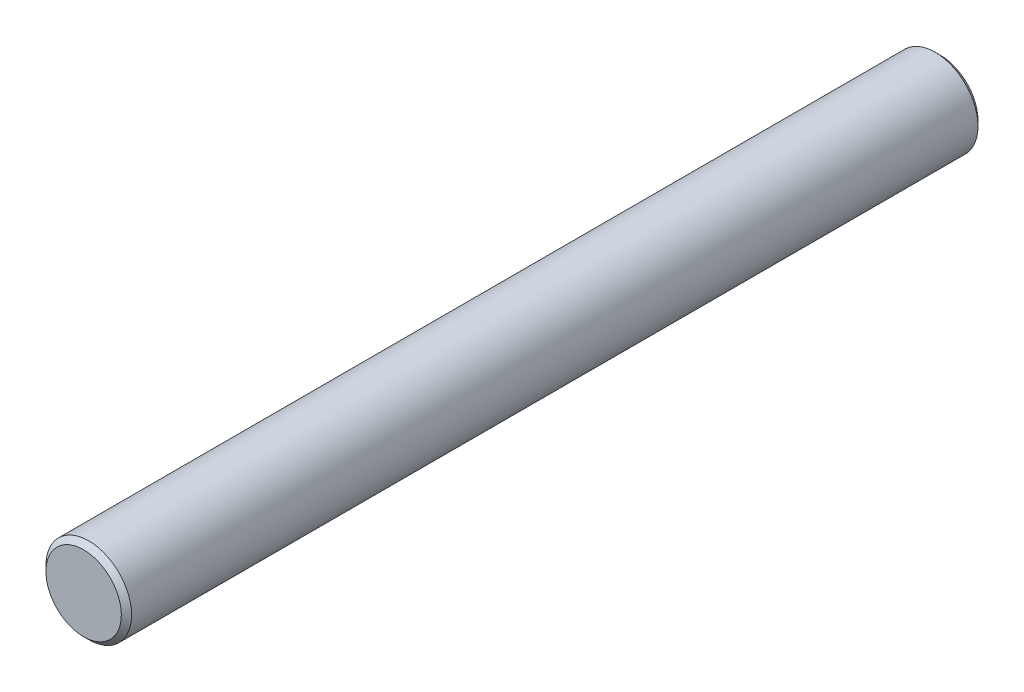
ISO-10303-21;
HEADER;
FILE_DESCRIPTION(('STEP AP214'),'2;1');
FILE_NAME('part.step','',(''),(''),'','','');
FILE_SCHEMA(('AUTOMOTIVE_DESIGN { 1 0 10303 214 1 1 1 1 }'));
ENDSEC;
DATA;
#1=APPLICATION_CONTEXT('core data for automotive mechanical design processes');
#2=APPLICATION_PROTOCOL_DEFINITION('international standard','automotive_design',2000,#1);
#3=PRODUCT_CONTEXT('',#1,'mechanical');
#4=PRODUCT('Part','Part','',(#3));
#5=PRODUCT_RELATED_PRODUCT_CATEGORY('part','',(#4));
#6=PRODUCT_DEFINITION_FORMATION('','',#4);
#7=PRODUCT_DEFINITION_CONTEXT('part definition',#1,'design');
#8=PRODUCT_DEFINITION('design','',#6,#7);
#9=PRODUCT_DEFINITION_SHAPE('','',#8);
#10=(LENGTH_UNIT() NAMED_UNIT(*) SI_UNIT(.MILLI.,.METRE.));
#11=(NAMED_UNIT(*) PLANE_ANGLE_UNIT() SI_UNIT($,.RADIAN.));
#12=(NAMED_UNIT(*) SI_UNIT($,.STERADIAN.) SOLID_ANGLE_UNIT());
#13=UNCERTAINTY_MEASURE_WITH_UNIT(LENGTH_MEASURE(1.E-05),#10,'distance_accuracy_value','');
#14=(GEOMETRIC_REPRESENTATION_CONTEXT(3) GLOBAL_UNCERTAINTY_ASSIGNED_CONTEXT((#13)) GLOBAL_UNIT_ASSIGNED_CONTEXT((#10,
#11,#12)) REPRESENTATION_CONTEXT('',''));
#15=CARTESIAN_POINT('',(0.,0.,0.));
#16=DIRECTION('',(0.,0.,1.));
#17=DIRECTION('',(1.,0.,0.));
#18=AXIS2_PLACEMENT_3D('',#15,#16,#17);
#19=CARTESIAN_POINT('',(0.,0.,50.));
#20=DIRECTION('',(0.,0.,-1.));
#21=DIRECTION('',(-1.,0.,0.));
#22=AXIS2_PLACEMENT_3D('',#19,#20,#21);
#23=CYLINDRICAL_SURFACE('',#22,2.5);
#24=CARTESIAN_POINT('',(0.,0.,0.299999999999995));
#25=DIRECTION('',(0.,0.,1.));
#26=DIRECTION('',(1.,0.,0.));
#27=AXIS2_PLACEMENT_3D('',#24,#25,#26);
#28=CIRCLE('',#27,2.5);
#29=CARTESIAN_POINT('',(2.5,0.,0.299999999999995));
#30=VERTEX_POINT('',#29);
#31=EDGE_CURVE('E44',#30,#30,#28,.T.);
#32=ORIENTED_EDGE('',*,*,#31,.T.);
#33=EDGE_LOOP('',(#32));
#34=FACE_BOUND('',#33,.T.);
#35=CARTESIAN_POINT('',(0.,0.,49.7));
#36=DIRECTION('',(0.,0.,1.));
#37=DIRECTION('',(1.,0.,0.));
#38=AXIS2_PLACEMENT_3D('',#35,#36,#37);
#39=CIRCLE('',#38,2.5);
#40=CARTESIAN_POINT('',(2.5,0.,49.7));
#41=VERTEX_POINT('',#40);
#42=EDGE_CURVE('E48',#41,#41,#39,.F.);
#43=ORIENTED_EDGE('',*,*,#42,.T.);
#44=EDGE_LOOP('',(#43));
#45=FACE_BOUND('',#44,.T.);
#46=ADVANCED_FACE('F33',(#34,#45),#23,.T.);
#47=CARTESIAN_POINT('',(0.,0.,50.));
#48=DIRECTION('',(0.,0.,1.));
#49=DIRECTION('',(1.,0.,0.));
#50=AXIS2_PLACEMENT_3D('',#47,#48,#49);
#51=PLANE('',#50);
#52=CARTESIAN_POINT('',(0.,0.,50.));
#53=DIRECTION('',(0.,0.,1.));
#54=DIRECTION('',(1.,0.,0.));
#55=AXIS2_PLACEMENT_3D('',#52,#53,#54);
#56=CIRCLE('',#55,2.2);
#57=CARTESIAN_POINT('',(2.2,0.,50.));
#58=VERTEX_POINT('',#57);
#59=EDGE_CURVE('E10',#58,#58,#56,.T.);
#60=ORIENTED_EDGE('',*,*,#59,.T.);
#61=EDGE_LOOP('',(#60));
#62=FACE_BOUND('',#61,.T.);
#63=ADVANCED_FACE('F64',(#62),#51,.T.);
#64=CARTESIAN_POINT('',(0.,0.,0.));
#65=DIRECTION('',(0.,0.,1.));
#66=DIRECTION('',(1.,0.,0.));
#67=AXIS2_PLACEMENT_3D('',#64,#65,#66);
#68=PLANE('',#67);
#69=CARTESIAN_POINT('',(0.,0.,0.));
#70=DIRECTION('',(0.,0.,1.));
#71=DIRECTION('',(1.,0.,0.));
#72=AXIS2_PLACEMENT_3D('',#69,#70,#71);
#73=CIRCLE('',#72,2.20000000000001);
#74=CARTESIAN_POINT('',(2.20000000000001,0.,0.));
#75=VERTEX_POINT('',#74);
#76=EDGE_CURVE('E40',#75,#75,#73,.F.);
#77=ORIENTED_EDGE('',*,*,#76,.T.);
#78=EDGE_LOOP('',(#77));
#79=FACE_BOUND('',#78,.T.);
#80=ADVANCED_FACE('F61',(#79),#68,.F.);
#81=CARTESIAN_POINT('',(0.,0.,0.299999999999995));
#82=DIRECTION('',(0.,0.,1.));
#83=DIRECTION('',(1.,0.,0.));
#84=AXIS2_PLACEMENT_3D('',#81,#82,#83);
#85=CONICAL_SURFACE('',#84,2.5,0.785398163397445);
#86=ORIENTED_EDGE('',*,*,#76,.F.);
#87=EDGE_LOOP('',(#86));
#88=FACE_BOUND('',#87,.T.);
#89=ORIENTED_EDGE('',*,*,#31,.F.);
#90=EDGE_LOOP('',(#89));
#91=FACE_BOUND('',#90,.T.);
#92=ADVANCED_FACE('F57',(#88,#91),#85,.T.);
#93=CARTESIAN_POINT('',(0.,0.,50.));
#94=DIRECTION('',(0.,0.,-1.));
#95=DIRECTION('',(-1.,0.,0.));
#96=AXIS2_PLACEMENT_3D('',#93,#94,#95);
#97=CONICAL_SURFACE('',#96,2.2,0.785398163397456);
#98=ORIENTED_EDGE('',*,*,#42,.F.);
#99=EDGE_LOOP('',(#98));
#100=FACE_BOUND('',#99,.T.);
#101=ORIENTED_EDGE('',*,*,#59,.F.);
#102=EDGE_LOOP('',(#101));
#103=FACE_BOUND('',#102,.T.);
#104=ADVANCED_FACE('F35',(#100,#103),#97,.T.);
#105=CLOSED_SHELL('',(#46,#63,#80,#92,#104));
#106=MANIFOLD_SOLID_BREP('B2',#105);
#107=ADVANCED_BREP_SHAPE_REPRESENTATION('',(#18,#106),#14);
#108=SHAPE_DEFINITION_REPRESENTATION(#9,#107);
ENDSEC;
END-ISO-10303-21;
